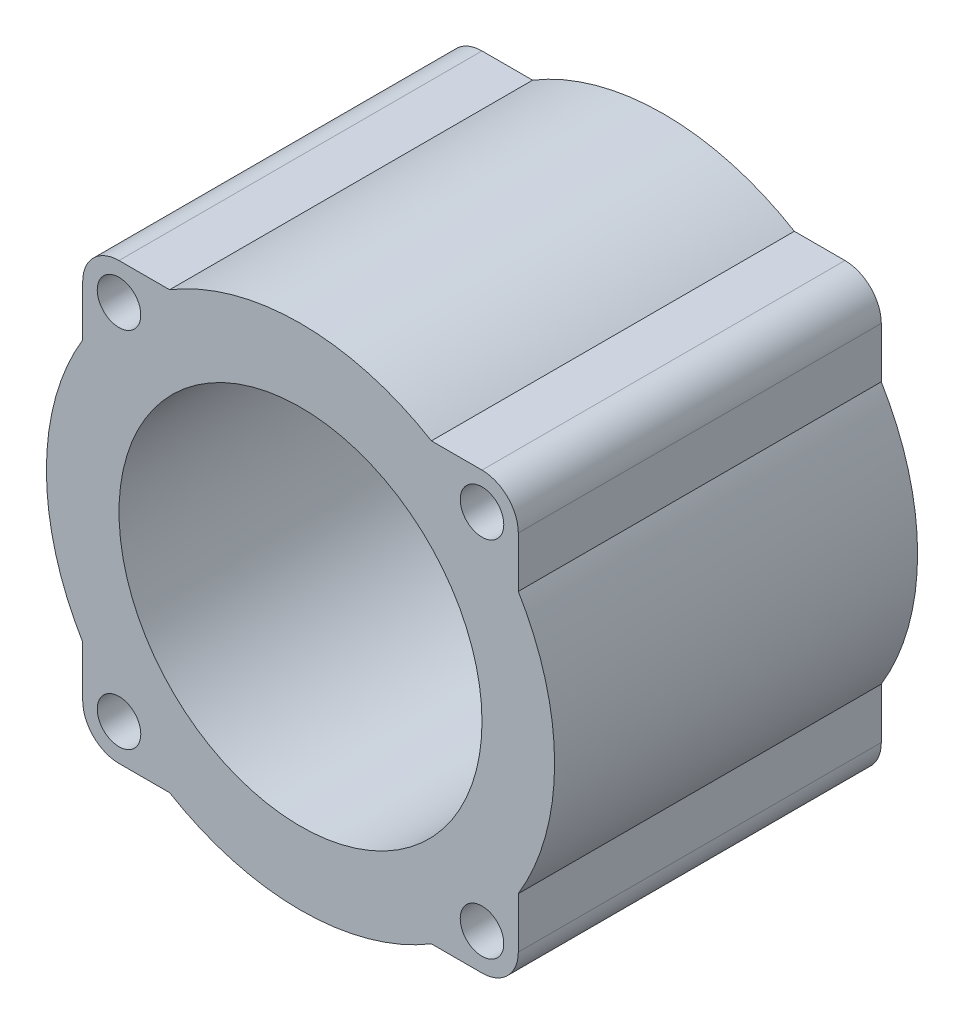
ISO-10303-21;
HEADER;
FILE_DESCRIPTION(('STEP AP214'),'2;1');
FILE_NAME('part.step','',(''),(''),'','','');
FILE_SCHEMA(('AUTOMOTIVE_DESIGN { 1 0 10303 214 1 1 1 1 }'));
ENDSEC;
DATA;
#1=APPLICATION_CONTEXT('core data for automotive mechanical design processes');
#2=APPLICATION_PROTOCOL_DEFINITION('international standard','automotive_design',2000,#1);
#3=PRODUCT_CONTEXT('',#1,'mechanical');
#4=PRODUCT('Part','Part','',(#3));
#5=PRODUCT_RELATED_PRODUCT_CATEGORY('part','',(#4));
#6=PRODUCT_DEFINITION_FORMATION('','',#4);
#7=PRODUCT_DEFINITION_CONTEXT('part definition',#1,'design');
#8=PRODUCT_DEFINITION('design','',#6,#7);
#9=PRODUCT_DEFINITION_SHAPE('','',#8);
#10=(LENGTH_UNIT() NAMED_UNIT(*) SI_UNIT(.MILLI.,.METRE.));
#11=(NAMED_UNIT(*) PLANE_ANGLE_UNIT() SI_UNIT($,.RADIAN.));
#12=(NAMED_UNIT(*) SI_UNIT($,.STERADIAN.) SOLID_ANGLE_UNIT());
#13=UNCERTAINTY_MEASURE_WITH_UNIT(LENGTH_MEASURE(1.E-05),#10,'distance_accuracy_value','');
#14=(GEOMETRIC_REPRESENTATION_CONTEXT(3) GLOBAL_UNCERTAINTY_ASSIGNED_CONTEXT((#13)) GLOBAL_UNIT_ASSIGNED_CONTEXT((#10,
#11,#12)) REPRESENTATION_CONTEXT('',''));
#15=CARTESIAN_POINT('',(0.,0.,0.));
#16=DIRECTION('',(0.,0.,1.));
#17=DIRECTION('',(1.,0.,0.));
#18=AXIS2_PLACEMENT_3D('',#15,#16,#17);
#19=CARTESIAN_POINT('',(5.,5.,10.));
#20=DIRECTION('',(0.,0.,1.));
#21=DIRECTION('',(1.,0.,0.));
#22=AXIS2_PLACEMENT_3D('',#19,#20,#21);
#23=PLANE('',#22);
#24=CARTESIAN_POINT('',(5.,-5.,10.));
#25=DIRECTION('',(0.,0.,1.));
#26=DIRECTION('',(-1.,0.,0.));
#27=AXIS2_PLACEMENT_3D('',#24,#25,#26);
#28=CIRCLE('',#27,0.6);
#29=CARTESIAN_POINT('',(4.4,-5.,10.));
#30=VERTEX_POINT('',#29);
#31=EDGE_CURVE('E353',#30,#30,#28,.T.);
#32=ORIENTED_EDGE('',*,*,#31,.F.);
#33=EDGE_LOOP('',(#32));
#34=FACE_BOUND('',#33,.T.);
#35=CARTESIAN_POINT('',(-5.,5.,10.));
#36=DIRECTION('',(0.,0.,1.));
#37=DIRECTION('',(-1.,0.,0.));
#38=AXIS2_PLACEMENT_3D('',#35,#36,#37);
#39=CIRCLE('',#38,0.6);
#40=CARTESIAN_POINT('',(-5.6,5.,10.));
#41=VERTEX_POINT('',#40);
#42=EDGE_CURVE('E365',#41,#41,#39,.T.);
#43=ORIENTED_EDGE('',*,*,#42,.F.);
#44=EDGE_LOOP('',(#43));
#45=FACE_BOUND('',#44,.T.);
#46=CARTESIAN_POINT('',(5.,5.,10.));
#47=DIRECTION('',(0.,0.,1.));
#48=DIRECTION('',(1.,0.,0.));
#49=AXIS2_PLACEMENT_3D('',#46,#47,#48);
#50=CIRCLE('',#49,1.);
#51=CARTESIAN_POINT('',(6.,4.99999999999999,10.));
#52=VERTEX_POINT('',#51);
#53=CARTESIAN_POINT('',(4.99999999999999,6.,10.));
#54=VERTEX_POINT('',#53);
#55=EDGE_CURVE('E215',#52,#54,#50,.T.);
#56=ORIENTED_EDGE('',*,*,#55,.T.);
#57=DIRECTION('',(-1.,0.,0.));
#58=VECTOR('',#57,1.);
#59=CARTESIAN_POINT('',(3.60555127546399,6.,10.));
#60=LINE('',#59,#58);
#61=CARTESIAN_POINT('',(3.60555127546399,6.,10.));
#62=VERTEX_POINT('',#61);
#63=EDGE_CURVE('E123',#54,#62,#60,.T.);
#64=ORIENTED_EDGE('',*,*,#63,.T.);
#65=CARTESIAN_POINT('',(0.,0.,10.));
#66=DIRECTION('',(0.,0.,1.));
#67=DIRECTION('',(1.,0.,0.));
#68=AXIS2_PLACEMENT_3D('',#65,#66,#67);
#69=CIRCLE('',#68,7.);
#70=CARTESIAN_POINT('',(-3.60555127546399,6.,10.));
#71=VERTEX_POINT('',#70);
#72=EDGE_CURVE('E254',#62,#71,#69,.T.);
#73=ORIENTED_EDGE('',*,*,#72,.T.);
#74=DIRECTION('',(-1.,0.,0.));
#75=VECTOR('',#74,1.);
#76=CARTESIAN_POINT('',(-3.60555127546399,6.,10.));
#77=LINE('',#76,#75);
#78=CARTESIAN_POINT('',(-4.99999999999999,6.,10.));
#79=VERTEX_POINT('',#78);
#80=EDGE_CURVE('E273',#71,#79,#77,.T.);
#81=ORIENTED_EDGE('',*,*,#80,.T.);
#82=CARTESIAN_POINT('',(-5.,5.,10.));
#83=DIRECTION('',(0.,0.,1.));
#84=DIRECTION('',(-1.,0.,0.));
#85=AXIS2_PLACEMENT_3D('',#82,#83,#84);
#86=CIRCLE('',#85,1.);
#87=CARTESIAN_POINT('',(-6.,4.99999999999999,10.));
#88=VERTEX_POINT('',#87);
#89=EDGE_CURVE('E270',#79,#88,#86,.T.);
#90=ORIENTED_EDGE('',*,*,#89,.T.);
#91=DIRECTION('',(0.,-1.,0.));
#92=VECTOR('',#91,1.);
#93=CARTESIAN_POINT('',(-6.,4.99999999999999,10.));
#94=LINE('',#93,#92);
#95=CARTESIAN_POINT('',(-6.,3.60555127546399,10.));
#96=VERTEX_POINT('',#95);
#97=EDGE_CURVE('E272',#88,#96,#94,.T.);
#98=ORIENTED_EDGE('',*,*,#97,.T.);
#99=CARTESIAN_POINT('',(0.,0.,10.));
#100=DIRECTION('',(0.,0.,1.));
#101=DIRECTION('',(1.,0.,0.));
#102=AXIS2_PLACEMENT_3D('',#99,#100,#101);
#103=CIRCLE('',#102,7.);
#104=CARTESIAN_POINT('',(-6.,-3.60555127546399,10.));
#105=VERTEX_POINT('',#104);
#106=EDGE_CURVE('E275',#96,#105,#103,.T.);
#107=ORIENTED_EDGE('',*,*,#106,.T.);
#108=DIRECTION('',(0.,-1.,0.));
#109=VECTOR('',#108,1.);
#110=CARTESIAN_POINT('',(-6.,-4.99999999999999,10.));
#111=LINE('',#110,#109);
#112=CARTESIAN_POINT('',(-6.,-4.99999999999999,10.));
#113=VERTEX_POINT('',#112);
#114=EDGE_CURVE('E281',#105,#113,#111,.T.);
#115=ORIENTED_EDGE('',*,*,#114,.T.);
#116=CARTESIAN_POINT('',(-5.,-5.,10.));
#117=DIRECTION('',(0.,0.,1.));
#118=DIRECTION('',(1.,0.,0.));
#119=AXIS2_PLACEMENT_3D('',#116,#117,#118);
#120=CIRCLE('',#119,1.);
#121=CARTESIAN_POINT('',(-4.99999999999999,-6.,10.));
#122=VERTEX_POINT('',#121);
#123=EDGE_CURVE('E283',#113,#122,#120,.T.);
#124=ORIENTED_EDGE('',*,*,#123,.T.);
#125=DIRECTION('',(1.,0.,0.));
#126=VECTOR('',#125,1.);
#127=CARTESIAN_POINT('',(-3.60555127546399,-6.,10.));
#128=LINE('',#127,#126);
#129=CARTESIAN_POINT('',(-3.60555127546399,-6.,10.));
#130=VERTEX_POINT('',#129);
#131=EDGE_CURVE('E285',#122,#130,#128,.T.);
#132=ORIENTED_EDGE('',*,*,#131,.T.);
#133=CARTESIAN_POINT('',(0.,0.,10.));
#134=DIRECTION('',(0.,0.,1.));
#135=DIRECTION('',(1.,0.,0.));
#136=AXIS2_PLACEMENT_3D('',#133,#134,#135);
#137=CIRCLE('',#136,7.);
#138=CARTESIAN_POINT('',(3.60555127546399,-6.,10.));
#139=VERTEX_POINT('',#138);
#140=EDGE_CURVE('E287',#130,#139,#137,.T.);
#141=ORIENTED_EDGE('',*,*,#140,.T.);
#142=DIRECTION('',(1.,0.,0.));
#143=VECTOR('',#142,1.);
#144=CARTESIAN_POINT('',(3.60555127546399,-6.,10.));
#145=LINE('',#144,#143);
#146=CARTESIAN_POINT('',(4.99999999999999,-6.,10.));
#147=VERTEX_POINT('',#146);
#148=EDGE_CURVE('E289',#139,#147,#145,.T.);
#149=ORIENTED_EDGE('',*,*,#148,.T.);
#150=CARTESIAN_POINT('',(5.,-5.,10.));
#151=DIRECTION('',(0.,0.,1.));
#152=DIRECTION('',(-1.,0.,0.));
#153=AXIS2_PLACEMENT_3D('',#150,#151,#152);
#154=CIRCLE('',#153,1.);
#155=CARTESIAN_POINT('',(6.,-4.99999999999999,10.));
#156=VERTEX_POINT('',#155);
#157=EDGE_CURVE('E166',#147,#156,#154,.T.);
#158=ORIENTED_EDGE('',*,*,#157,.T.);
#159=DIRECTION('',(0.,1.,0.));
#160=VECTOR('',#159,1.);
#161=CARTESIAN_POINT('',(6.,-4.99999999999999,10.));
#162=LINE('',#161,#160);
#163=CARTESIAN_POINT('',(6.,-3.60555127546399,10.));
#164=VERTEX_POINT('',#163);
#165=EDGE_CURVE('E160',#156,#164,#162,.T.);
#166=ORIENTED_EDGE('',*,*,#165,.T.);
#167=CARTESIAN_POINT('',(0.,0.,10.));
#168=DIRECTION('',(0.,0.,1.));
#169=DIRECTION('',(1.,0.,0.));
#170=AXIS2_PLACEMENT_3D('',#167,#168,#169);
#171=CIRCLE('',#170,7.);
#172=CARTESIAN_POINT('',(6.,3.60555127546399,10.));
#173=VERTEX_POINT('',#172);
#174=EDGE_CURVE('E164',#164,#173,#171,.T.);
#175=ORIENTED_EDGE('',*,*,#174,.T.);
#176=DIRECTION('',(0.,1.,0.));
#177=VECTOR('',#176,1.);
#178=CARTESIAN_POINT('',(6.,4.99999999999999,10.));
#179=LINE('',#178,#177);
#180=EDGE_CURVE('E56',#173,#52,#179,.T.);
#181=ORIENTED_EDGE('',*,*,#180,.T.);
#182=EDGE_LOOP('',(#56,#64,#73,#81,#90,#98,#107,#115,#124,#132,#141,#149,#158,#166,#175,#181));
#183=FACE_BOUND('',#182,.T.);
#184=CARTESIAN_POINT('',(5.,5.,10.));
#185=DIRECTION('',(0.,0.,1.));
#186=DIRECTION('',(1.,0.,0.));
#187=AXIS2_PLACEMENT_3D('',#184,#185,#186);
#188=CIRCLE('',#187,0.6);
#189=CARTESIAN_POINT('',(5.6,5.,10.));
#190=VERTEX_POINT('',#189);
#191=EDGE_CURVE('E188',#190,#190,#188,.T.);
#192=ORIENTED_EDGE('',*,*,#191,.F.);
#193=EDGE_LOOP('',(#192));
#194=FACE_BOUND('',#193,.T.);
#195=CARTESIAN_POINT('',(0.,0.,10.));
#196=DIRECTION('',(0.,0.,1.));
#197=DIRECTION('',(1.,0.,0.));
#198=AXIS2_PLACEMENT_3D('',#195,#196,#197);
#199=CIRCLE('',#198,5.);
#200=CARTESIAN_POINT('',(5.,0.,10.));
#201=VERTEX_POINT('',#200);
#202=EDGE_CURVE('E359',#201,#201,#199,.T.);
#203=ORIENTED_EDGE('',*,*,#202,.F.);
#204=EDGE_LOOP('',(#203));
#205=FACE_BOUND('',#204,.T.);
#206=CARTESIAN_POINT('',(-5.,-5.,10.));
#207=DIRECTION('',(0.,0.,1.));
#208=DIRECTION('',(1.,0.,0.));
#209=AXIS2_PLACEMENT_3D('',#206,#207,#208);
#210=CIRCLE('',#209,0.6);
#211=CARTESIAN_POINT('',(-4.4,-5.,10.));
#212=VERTEX_POINT('',#211);
#213=EDGE_CURVE('E344',#212,#212,#210,.T.);
#214=ORIENTED_EDGE('',*,*,#213,.F.);
#215=EDGE_LOOP('',(#214));
#216=FACE_BOUND('',#215,.T.);
#217=ADVANCED_FACE('F39',(#34,#45,#183,#194,#205,#216),#23,.T.);
#218=CARTESIAN_POINT('',(5.,5.,0.));
#219=DIRECTION('',(0.,0.,1.));
#220=DIRECTION('',(1.,0.,0.));
#221=AXIS2_PLACEMENT_3D('',#218,#219,#220);
#222=PLANE('',#221);
#223=CARTESIAN_POINT('',(5.,5.,0.));
#224=DIRECTION('',(0.,0.,1.));
#225=DIRECTION('',(1.,0.,0.));
#226=AXIS2_PLACEMENT_3D('',#223,#224,#225);
#227=CIRCLE('',#226,1.);
#228=CARTESIAN_POINT('',(6.,4.99999999999999,0.));
#229=VERTEX_POINT('',#228);
#230=CARTESIAN_POINT('',(4.99999999999999,6.,0.));
#231=VERTEX_POINT('',#230);
#232=EDGE_CURVE('E184',#229,#231,#227,.T.);
#233=ORIENTED_EDGE('',*,*,#232,.F.);
#234=DIRECTION('',(0.,1.,0.));
#235=VECTOR('',#234,1.);
#236=CARTESIAN_POINT('',(6.,4.99999999999999,0.));
#237=LINE('',#236,#235);
#238=CARTESIAN_POINT('',(6.,3.60555127546399,0.));
#239=VERTEX_POINT('',#238);
#240=EDGE_CURVE('E115',#239,#229,#237,.T.);
#241=ORIENTED_EDGE('',*,*,#240,.F.);
#242=CARTESIAN_POINT('',(0.,0.,0.));
#243=DIRECTION('',(0.,0.,1.));
#244=DIRECTION('',(1.,0.,0.));
#245=AXIS2_PLACEMENT_3D('',#242,#243,#244);
#246=CIRCLE('',#245,7.);
#247=CARTESIAN_POINT('',(6.,-3.60555127546399,0.));
#248=VERTEX_POINT('',#247);
#249=EDGE_CURVE('E109',#248,#239,#246,.T.);
#250=ORIENTED_EDGE('',*,*,#249,.F.);
#251=DIRECTION('',(0.,1.,0.));
#252=VECTOR('',#251,1.);
#253=CARTESIAN_POINT('',(6.,-4.99999999999999,0.));
#254=LINE('',#253,#252);
#255=CARTESIAN_POINT('',(6.,-4.99999999999999,0.));
#256=VERTEX_POINT('',#255);
#257=EDGE_CURVE('E174',#256,#248,#254,.T.);
#258=ORIENTED_EDGE('',*,*,#257,.F.);
#259=CARTESIAN_POINT('',(5.,-5.,0.));
#260=DIRECTION('',(0.,0.,1.));
#261=DIRECTION('',(-1.,0.,0.));
#262=AXIS2_PLACEMENT_3D('',#259,#260,#261);
#263=CIRCLE('',#262,1.);
#264=CARTESIAN_POINT('',(4.99999999999999,-6.,0.));
#265=VERTEX_POINT('',#264);
#266=EDGE_CURVE('E210',#265,#256,#263,.T.);
#267=ORIENTED_EDGE('',*,*,#266,.F.);
#268=DIRECTION('',(1.,0.,0.));
#269=VECTOR('',#268,1.);
#270=CARTESIAN_POINT('',(3.60555127546399,-6.,0.));
#271=LINE('',#270,#269);
#272=CARTESIAN_POINT('',(3.60555127546399,-6.,0.));
#273=VERTEX_POINT('',#272);
#274=EDGE_CURVE('E208',#273,#265,#271,.T.);
#275=ORIENTED_EDGE('',*,*,#274,.F.);
#276=CARTESIAN_POINT('',(0.,0.,0.));
#277=DIRECTION('',(0.,0.,1.));
#278=DIRECTION('',(1.,0.,0.));
#279=AXIS2_PLACEMENT_3D('',#276,#277,#278);
#280=CIRCLE('',#279,7.);
#281=CARTESIAN_POINT('',(-3.60555127546399,-6.,0.));
#282=VERTEX_POINT('',#281);
#283=EDGE_CURVE('E206',#282,#273,#280,.T.);
#284=ORIENTED_EDGE('',*,*,#283,.F.);
#285=DIRECTION('',(1.,0.,0.));
#286=VECTOR('',#285,1.);
#287=CARTESIAN_POINT('',(-3.60555127546399,-6.,0.));
#288=LINE('',#287,#286);
#289=CARTESIAN_POINT('',(-4.99999999999999,-6.,0.));
#290=VERTEX_POINT('',#289);
#291=EDGE_CURVE('E204',#290,#282,#288,.T.);
#292=ORIENTED_EDGE('',*,*,#291,.F.);
#293=CARTESIAN_POINT('',(-5.,-5.,0.));
#294=DIRECTION('',(0.,0.,1.));
#295=DIRECTION('',(1.,0.,0.));
#296=AXIS2_PLACEMENT_3D('',#293,#294,#295);
#297=CIRCLE('',#296,1.);
#298=CARTESIAN_POINT('',(-6.,-4.99999999999999,0.));
#299=VERTEX_POINT('',#298);
#300=EDGE_CURVE('E202',#299,#290,#297,.T.);
#301=ORIENTED_EDGE('',*,*,#300,.F.);
#302=DIRECTION('',(0.,-1.,0.));
#303=VECTOR('',#302,1.);
#304=CARTESIAN_POINT('',(-6.,-4.99999999999999,0.));
#305=LINE('',#304,#303);
#306=CARTESIAN_POINT('',(-6.,-3.60555127546399,0.));
#307=VERTEX_POINT('',#306);
#308=EDGE_CURVE('E200',#307,#299,#305,.T.);
#309=ORIENTED_EDGE('',*,*,#308,.F.);
#310=CARTESIAN_POINT('',(0.,0.,0.));
#311=DIRECTION('',(0.,0.,1.));
#312=DIRECTION('',(1.,0.,0.));
#313=AXIS2_PLACEMENT_3D('',#310,#311,#312);
#314=CIRCLE('',#313,7.);
#315=CARTESIAN_POINT('',(-6.,3.60555127546399,0.));
#316=VERTEX_POINT('',#315);
#317=EDGE_CURVE('E198',#316,#307,#314,.T.);
#318=ORIENTED_EDGE('',*,*,#317,.F.);
#319=DIRECTION('',(0.,-1.,0.));
#320=VECTOR('',#319,1.);
#321=CARTESIAN_POINT('',(-6.,4.99999999999999,0.));
#322=LINE('',#321,#320);
#323=CARTESIAN_POINT('',(-6.,4.99999999999999,0.));
#324=VERTEX_POINT('',#323);
#325=EDGE_CURVE('E196',#324,#316,#322,.T.);
#326=ORIENTED_EDGE('',*,*,#325,.F.);
#327=CARTESIAN_POINT('',(-5.,5.,0.));
#328=DIRECTION('',(0.,0.,1.));
#329=DIRECTION('',(-1.,0.,0.));
#330=AXIS2_PLACEMENT_3D('',#327,#328,#329);
#331=CIRCLE('',#330,1.);
#332=CARTESIAN_POINT('',(-4.99999999999999,6.,0.));
#333=VERTEX_POINT('',#332);
#334=EDGE_CURVE('E194',#333,#324,#331,.T.);
#335=ORIENTED_EDGE('',*,*,#334,.F.);
#336=DIRECTION('',(-1.,0.,0.));
#337=VECTOR('',#336,1.);
#338=CARTESIAN_POINT('',(-3.60555127546399,6.,0.));
#339=LINE('',#338,#337);
#340=CARTESIAN_POINT('',(-3.60555127546399,6.,0.));
#341=VERTEX_POINT('',#340);
#342=EDGE_CURVE('E192',#341,#333,#339,.T.);
#343=ORIENTED_EDGE('',*,*,#342,.F.);
#344=CARTESIAN_POINT('',(0.,0.,0.));
#345=DIRECTION('',(0.,0.,1.));
#346=DIRECTION('',(1.,0.,0.));
#347=AXIS2_PLACEMENT_3D('',#344,#345,#346);
#348=CIRCLE('',#347,7.);
#349=CARTESIAN_POINT('',(3.60555127546399,6.,0.));
#350=VERTEX_POINT('',#349);
#351=EDGE_CURVE('E190',#350,#341,#348,.T.);
#352=ORIENTED_EDGE('',*,*,#351,.F.);
#353=DIRECTION('',(-1.,0.,0.));
#354=VECTOR('',#353,1.);
#355=CARTESIAN_POINT('',(3.60555127546399,6.,0.));
#356=LINE('',#355,#354);
#357=EDGE_CURVE('E187',#231,#350,#356,.T.);
#358=ORIENTED_EDGE('',*,*,#357,.F.);
#359=EDGE_LOOP('',(#233,#241,#250,#258,#267,#275,#284,#292,#301,#309,#318,#326,#335,#343,#352,#358));
#360=FACE_BOUND('',#359,.T.);
#361=CARTESIAN_POINT('',(5.,5.,0.));
#362=DIRECTION('',(0.,0.,1.));
#363=DIRECTION('',(1.,0.,0.));
#364=AXIS2_PLACEMENT_3D('',#361,#362,#363);
#365=CIRCLE('',#364,0.6);
#366=CARTESIAN_POINT('',(5.6,5.,0.));
#367=VERTEX_POINT('',#366);
#368=EDGE_CURVE('E368',#367,#367,#365,.T.);
#369=ORIENTED_EDGE('',*,*,#368,.T.);
#370=EDGE_LOOP('',(#369));
#371=FACE_BOUND('',#370,.T.);
#372=CARTESIAN_POINT('',(-5.,5.,0.));
#373=DIRECTION('',(0.,0.,1.));
#374=DIRECTION('',(-1.,0.,0.));
#375=AXIS2_PLACEMENT_3D('',#372,#373,#374);
#376=CIRCLE('',#375,0.6);
#377=CARTESIAN_POINT('',(-5.6,5.,0.));
#378=VERTEX_POINT('',#377);
#379=EDGE_CURVE('E362',#378,#378,#376,.T.);
#380=ORIENTED_EDGE('',*,*,#379,.T.);
#381=EDGE_LOOP('',(#380));
#382=FACE_BOUND('',#381,.T.);
#383=CARTESIAN_POINT('',(0.,0.,0.));
#384=DIRECTION('',(0.,0.,1.));
#385=DIRECTION('',(1.,0.,0.));
#386=AXIS2_PLACEMENT_3D('',#383,#384,#385);
#387=CIRCLE('',#386,5.);
#388=CARTESIAN_POINT('',(5.,0.,0.));
#389=VERTEX_POINT('',#388);
#390=EDGE_CURVE('E356',#389,#389,#387,.T.);
#391=ORIENTED_EDGE('',*,*,#390,.T.);
#392=EDGE_LOOP('',(#391));
#393=FACE_BOUND('',#392,.T.);
#394=CARTESIAN_POINT('',(5.,-5.,0.));
#395=DIRECTION('',(0.,0.,1.));
#396=DIRECTION('',(-1.,0.,0.));
#397=AXIS2_PLACEMENT_3D('',#394,#395,#396);
#398=CIRCLE('',#397,0.6);
#399=CARTESIAN_POINT('',(4.4,-5.,0.));
#400=VERTEX_POINT('',#399);
#401=EDGE_CURVE('E350',#400,#400,#398,.T.);
#402=ORIENTED_EDGE('',*,*,#401,.T.);
#403=EDGE_LOOP('',(#402));
#404=FACE_BOUND('',#403,.T.);
#405=CARTESIAN_POINT('',(-5.,-5.,0.));
#406=DIRECTION('',(0.,0.,1.));
#407=DIRECTION('',(1.,0.,0.));
#408=AXIS2_PLACEMENT_3D('',#405,#406,#407);
#409=CIRCLE('',#408,0.6);
#410=CARTESIAN_POINT('',(-4.4,-5.,0.));
#411=VERTEX_POINT('',#410);
#412=EDGE_CURVE('E347',#411,#411,#409,.T.);
#413=ORIENTED_EDGE('',*,*,#412,.T.);
#414=EDGE_LOOP('',(#413));
#415=FACE_BOUND('',#414,.T.);
#416=ADVANCED_FACE('F258',(#360,#371,#382,#393,#404,#415),#222,.F.);
#417=CARTESIAN_POINT('',(5.,5.,10.));
#418=DIRECTION('',(0.,0.,-1.));
#419=DIRECTION('',(-1.,0.,0.));
#420=AXIS2_PLACEMENT_3D('',#417,#418,#419);
#421=CYLINDRICAL_SURFACE('',#420,1.);
#422=ORIENTED_EDGE('',*,*,#232,.T.);
#423=DIRECTION('',(0.,0.,-1.));
#424=VECTOR('',#423,1.);
#425=CARTESIAN_POINT('',(4.99999999999999,6.,10.));
#426=LINE('',#425,#424);
#427=EDGE_CURVE('E11',#54,#231,#426,.T.);
#428=ORIENTED_EDGE('',*,*,#427,.F.);
#429=ORIENTED_EDGE('',*,*,#55,.F.);
#430=DIRECTION('',(0.,0.,-1.));
#431=VECTOR('',#430,1.);
#432=CARTESIAN_POINT('',(6.,4.99999999999999,10.));
#433=LINE('',#432,#431);
#434=EDGE_CURVE('E180',#52,#229,#433,.T.);
#435=ORIENTED_EDGE('',*,*,#434,.T.);
#436=EDGE_LOOP('',(#422,#428,#429,#435));
#437=FACE_BOUND('',#436,.T.);
#438=ADVANCED_FACE('F41',(#437),#421,.T.);
#439=CARTESIAN_POINT('',(3.60555127546399,6.,10.));
#440=DIRECTION('',(0.,-1.,0.));
#441=DIRECTION('',(0.,0.,-1.));
#442=AXIS2_PLACEMENT_3D('',#439,#440,#441);
#443=PLANE('',#442);
#444=ORIENTED_EDGE('',*,*,#357,.T.);
#445=DIRECTION('',(0.,0.,-1.));
#446=VECTOR('',#445,1.);
#447=CARTESIAN_POINT('',(3.60555127546399,6.,10.));
#448=LINE('',#447,#446);
#449=EDGE_CURVE('E48',#62,#350,#448,.T.);
#450=ORIENTED_EDGE('',*,*,#449,.F.);
#451=ORIENTED_EDGE('',*,*,#63,.F.);
#452=ORIENTED_EDGE('',*,*,#427,.T.);
#453=EDGE_LOOP('',(#444,#450,#451,#452));
#454=FACE_BOUND('',#453,.T.);
#455=ADVANCED_FACE('F508',(#454),#443,.F.);
#456=CARTESIAN_POINT('',(0.,0.,10.));
#457=DIRECTION('',(0.,0.,-1.));
#458=DIRECTION('',(-1.,0.,0.));
#459=AXIS2_PLACEMENT_3D('',#456,#457,#458);
#460=CYLINDRICAL_SURFACE('',#459,7.);
#461=ORIENTED_EDGE('',*,*,#351,.T.);
#462=DIRECTION('',(0.,0.,-1.));
#463=VECTOR('',#462,1.);
#464=CARTESIAN_POINT('',(-3.60555127546399,6.,10.));
#465=LINE('',#464,#463);
#466=EDGE_CURVE('E246',#71,#341,#465,.T.);
#467=ORIENTED_EDGE('',*,*,#466,.F.);
#468=ORIENTED_EDGE('',*,*,#72,.F.);
#469=ORIENTED_EDGE('',*,*,#449,.T.);
#470=EDGE_LOOP('',(#461,#467,#468,#469));
#471=FACE_BOUND('',#470,.T.);
#472=ADVANCED_FACE('F252',(#471),#460,.T.);
#473=CARTESIAN_POINT('',(-3.60555127546399,6.,10.));
#474=DIRECTION('',(0.,-1.,0.));
#475=DIRECTION('',(0.,0.,-1.));
#476=AXIS2_PLACEMENT_3D('',#473,#474,#475);
#477=PLANE('',#476);
#478=ORIENTED_EDGE('',*,*,#342,.T.);
#479=DIRECTION('',(0.,0.,-1.));
#480=VECTOR('',#479,1.);
#481=CARTESIAN_POINT('',(-4.99999999999999,6.,10.));
#482=LINE('',#481,#480);
#483=EDGE_CURVE('E243',#79,#333,#482,.T.);
#484=ORIENTED_EDGE('',*,*,#483,.F.);
#485=ORIENTED_EDGE('',*,*,#80,.F.);
#486=ORIENTED_EDGE('',*,*,#466,.T.);
#487=EDGE_LOOP('',(#478,#484,#485,#486));
#488=FACE_BOUND('',#487,.T.);
#489=ADVANCED_FACE('F264',(#488),#477,.F.);
#490=CARTESIAN_POINT('',(-5.,5.,10.));
#491=DIRECTION('',(0.,0.,-1.));
#492=DIRECTION('',(-1.,0.,0.));
#493=AXIS2_PLACEMENT_3D('',#490,#491,#492);
#494=CYLINDRICAL_SURFACE('',#493,1.);
#495=ORIENTED_EDGE('',*,*,#334,.T.);
#496=DIRECTION('',(0.,0.,-1.));
#497=VECTOR('',#496,1.);
#498=CARTESIAN_POINT('',(-6.,4.99999999999999,10.));
#499=LINE('',#498,#497);
#500=EDGE_CURVE('E240',#88,#324,#499,.T.);
#501=ORIENTED_EDGE('',*,*,#500,.F.);
#502=ORIENTED_EDGE('',*,*,#89,.F.);
#503=ORIENTED_EDGE('',*,*,#483,.T.);
#504=EDGE_LOOP('',(#495,#501,#502,#503));
#505=FACE_BOUND('',#504,.T.);
#506=ADVANCED_FACE('F268',(#505),#494,.T.);
#507=CARTESIAN_POINT('',(-6.,4.99999999999999,10.));
#508=DIRECTION('',(1.,0.,0.));
#509=DIRECTION('',(0.,1.,0.));
#510=AXIS2_PLACEMENT_3D('',#507,#508,#509);
#511=PLANE('',#510);
#512=ORIENTED_EDGE('',*,*,#325,.T.);
#513=DIRECTION('',(0.,0.,-1.));
#514=VECTOR('',#513,1.);
#515=CARTESIAN_POINT('',(-6.,3.60555127546399,10.));
#516=LINE('',#515,#514);
#517=EDGE_CURVE('E237',#96,#316,#516,.T.);
#518=ORIENTED_EDGE('',*,*,#517,.F.);
#519=ORIENTED_EDGE('',*,*,#97,.F.);
#520=ORIENTED_EDGE('',*,*,#500,.T.);
#521=EDGE_LOOP('',(#512,#518,#519,#520));
#522=FACE_BOUND('',#521,.T.);
#523=ADVANCED_FACE('F477',(#522),#511,.F.);
#524=CARTESIAN_POINT('',(0.,0.,10.));
#525=DIRECTION('',(0.,0.,-1.));
#526=DIRECTION('',(-1.,0.,0.));
#527=AXIS2_PLACEMENT_3D('',#524,#525,#526);
#528=CYLINDRICAL_SURFACE('',#527,7.);
#529=ORIENTED_EDGE('',*,*,#317,.T.);
#530=DIRECTION('',(0.,0.,-1.));
#531=VECTOR('',#530,1.);
#532=CARTESIAN_POINT('',(-6.,-3.60555127546399,10.));
#533=LINE('',#532,#531);
#534=EDGE_CURVE('E234',#105,#307,#533,.T.);
#535=ORIENTED_EDGE('',*,*,#534,.F.);
#536=ORIENTED_EDGE('',*,*,#106,.F.);
#537=ORIENTED_EDGE('',*,*,#517,.T.);
#538=EDGE_LOOP('',(#529,#535,#536,#537));
#539=FACE_BOUND('',#538,.T.);
#540=ADVANCED_FACE('F468',(#539),#528,.T.);
#541=CARTESIAN_POINT('',(-6.,-4.99999999999999,10.));
#542=DIRECTION('',(1.,0.,0.));
#543=DIRECTION('',(0.,1.,0.));
#544=AXIS2_PLACEMENT_3D('',#541,#542,#543);
#545=PLANE('',#544);
#546=ORIENTED_EDGE('',*,*,#308,.T.);
#547=DIRECTION('',(0.,0.,-1.));
#548=VECTOR('',#547,1.);
#549=CARTESIAN_POINT('',(-6.,-4.99999999999999,10.));
#550=LINE('',#549,#548);
#551=EDGE_CURVE('E231',#113,#299,#550,.T.);
#552=ORIENTED_EDGE('',*,*,#551,.F.);
#553=ORIENTED_EDGE('',*,*,#114,.F.);
#554=ORIENTED_EDGE('',*,*,#534,.T.);
#555=EDGE_LOOP('',(#546,#552,#553,#554));
#556=FACE_BOUND('',#555,.T.);
#557=ADVANCED_FACE('F459',(#556),#545,.F.);
#558=CARTESIAN_POINT('',(-5.,-5.,10.));
#559=DIRECTION('',(0.,0.,-1.));
#560=DIRECTION('',(-1.,0.,0.));
#561=AXIS2_PLACEMENT_3D('',#558,#559,#560);
#562=CYLINDRICAL_SURFACE('',#561,1.);
#563=ORIENTED_EDGE('',*,*,#300,.T.);
#564=DIRECTION('',(0.,0.,-1.));
#565=VECTOR('',#564,1.);
#566=CARTESIAN_POINT('',(-4.99999999999999,-6.,10.));
#567=LINE('',#566,#565);
#568=EDGE_CURVE('E228',#122,#290,#567,.T.);
#569=ORIENTED_EDGE('',*,*,#568,.F.);
#570=ORIENTED_EDGE('',*,*,#123,.F.);
#571=ORIENTED_EDGE('',*,*,#551,.T.);
#572=EDGE_LOOP('',(#563,#569,#570,#571));
#573=FACE_BOUND('',#572,.T.);
#574=ADVANCED_FACE('F450',(#573),#562,.T.);
#575=CARTESIAN_POINT('',(-3.60555127546399,-6.,10.));
#576=DIRECTION('',(0.,1.,0.));
#577=DIRECTION('',(0.,0.,1.));
#578=AXIS2_PLACEMENT_3D('',#575,#576,#577);
#579=PLANE('',#578);
#580=ORIENTED_EDGE('',*,*,#291,.T.);
#581=DIRECTION('',(0.,0.,-1.));
#582=VECTOR('',#581,1.);
#583=CARTESIAN_POINT('',(-3.60555127546399,-6.,10.));
#584=LINE('',#583,#582);
#585=EDGE_CURVE('E225',#130,#282,#584,.T.);
#586=ORIENTED_EDGE('',*,*,#585,.F.);
#587=ORIENTED_EDGE('',*,*,#131,.F.);
#588=ORIENTED_EDGE('',*,*,#568,.T.);
#589=EDGE_LOOP('',(#580,#586,#587,#588));
#590=FACE_BOUND('',#589,.T.);
#591=ADVANCED_FACE('F441',(#590),#579,.F.);
#592=CARTESIAN_POINT('',(0.,0.,10.));
#593=DIRECTION('',(0.,0.,-1.));
#594=DIRECTION('',(-1.,0.,0.));
#595=AXIS2_PLACEMENT_3D('',#592,#593,#594);
#596=CYLINDRICAL_SURFACE('',#595,7.);
#597=ORIENTED_EDGE('',*,*,#283,.T.);
#598=DIRECTION('',(0.,0.,-1.));
#599=VECTOR('',#598,1.);
#600=CARTESIAN_POINT('',(3.60555127546399,-6.,10.));
#601=LINE('',#600,#599);
#602=EDGE_CURVE('E222',#139,#273,#601,.T.);
#603=ORIENTED_EDGE('',*,*,#602,.F.);
#604=ORIENTED_EDGE('',*,*,#140,.F.);
#605=ORIENTED_EDGE('',*,*,#585,.T.);
#606=EDGE_LOOP('',(#597,#603,#604,#605));
#607=FACE_BOUND('',#606,.T.);
#608=ADVANCED_FACE('F433',(#607),#596,.T.);
#609=CARTESIAN_POINT('',(3.60555127546399,-6.,10.));
#610=DIRECTION('',(0.,1.,0.));
#611=DIRECTION('',(0.,0.,1.));
#612=AXIS2_PLACEMENT_3D('',#609,#610,#611);
#613=PLANE('',#612);
#614=ORIENTED_EDGE('',*,*,#274,.T.);
#615=DIRECTION('',(0.,0.,-1.));
#616=VECTOR('',#615,1.);
#617=CARTESIAN_POINT('',(4.99999999999999,-6.,10.));
#618=LINE('',#617,#616);
#619=EDGE_CURVE('E219',#147,#265,#618,.T.);
#620=ORIENTED_EDGE('',*,*,#619,.F.);
#621=ORIENTED_EDGE('',*,*,#148,.F.);
#622=ORIENTED_EDGE('',*,*,#602,.T.);
#623=EDGE_LOOP('',(#614,#620,#621,#622));
#624=FACE_BOUND('',#623,.T.);
#625=ADVANCED_FACE('F295',(#624),#613,.F.);
#626=CARTESIAN_POINT('',(5.,-5.,10.));
#627=DIRECTION('',(0.,0.,-1.));
#628=DIRECTION('',(-1.,0.,0.));
#629=AXIS2_PLACEMENT_3D('',#626,#627,#628);
#630=CYLINDRICAL_SURFACE('',#629,1.);
#631=ORIENTED_EDGE('',*,*,#266,.T.);
#632=DIRECTION('',(0.,0.,-1.));
#633=VECTOR('',#632,1.);
#634=CARTESIAN_POINT('',(6.,-4.99999999999999,10.));
#635=LINE('',#634,#633);
#636=EDGE_CURVE('E175',#156,#256,#635,.T.);
#637=ORIENTED_EDGE('',*,*,#636,.F.);
#638=ORIENTED_EDGE('',*,*,#157,.F.);
#639=ORIENTED_EDGE('',*,*,#619,.T.);
#640=EDGE_LOOP('',(#631,#637,#638,#639));
#641=FACE_BOUND('',#640,.T.);
#642=ADVANCED_FACE('F299',(#641),#630,.T.);
#643=CARTESIAN_POINT('',(6.,-4.99999999999999,10.));
#644=DIRECTION('',(-1.,0.,0.));
#645=DIRECTION('',(0.,-1.,0.));
#646=AXIS2_PLACEMENT_3D('',#643,#644,#645);
#647=PLANE('',#646);
#648=ORIENTED_EDGE('',*,*,#257,.T.);
#649=DIRECTION('',(0.,0.,-1.));
#650=VECTOR('',#649,1.);
#651=CARTESIAN_POINT('',(6.,-3.60555127546399,10.));
#652=LINE('',#651,#650);
#653=EDGE_CURVE('E171',#164,#248,#652,.T.);
#654=ORIENTED_EDGE('',*,*,#653,.F.);
#655=ORIENTED_EDGE('',*,*,#165,.F.);
#656=ORIENTED_EDGE('',*,*,#636,.T.);
#657=EDGE_LOOP('',(#648,#654,#655,#656));
#658=FACE_BOUND('',#657,.T.);
#659=ADVANCED_FACE('F172',(#658),#647,.F.);
#660=CARTESIAN_POINT('',(0.,0.,10.));
#661=DIRECTION('',(0.,0.,-1.));
#662=DIRECTION('',(-1.,0.,0.));
#663=AXIS2_PLACEMENT_3D('',#660,#661,#662);
#664=CYLINDRICAL_SURFACE('',#663,7.);
#665=ORIENTED_EDGE('',*,*,#249,.T.);
#666=DIRECTION('',(0.,0.,-1.));
#667=VECTOR('',#666,1.);
#668=CARTESIAN_POINT('',(6.,3.60555127546399,10.));
#669=LINE('',#668,#667);
#670=EDGE_CURVE('E176',#173,#239,#669,.T.);
#671=ORIENTED_EDGE('',*,*,#670,.F.);
#672=ORIENTED_EDGE('',*,*,#174,.F.);
#673=ORIENTED_EDGE('',*,*,#653,.T.);
#674=EDGE_LOOP('',(#665,#671,#672,#673));
#675=FACE_BOUND('',#674,.T.);
#676=ADVANCED_FACE('F178',(#675),#664,.T.);
#677=CARTESIAN_POINT('',(6.,4.99999999999999,10.));
#678=DIRECTION('',(-1.,0.,0.));
#679=DIRECTION('',(0.,-1.,0.));
#680=AXIS2_PLACEMENT_3D('',#677,#678,#679);
#681=PLANE('',#680);
#682=ORIENTED_EDGE('',*,*,#240,.T.);
#683=ORIENTED_EDGE('',*,*,#434,.F.);
#684=ORIENTED_EDGE('',*,*,#180,.F.);
#685=ORIENTED_EDGE('',*,*,#670,.T.);
#686=EDGE_LOOP('',(#682,#683,#684,#685));
#687=FACE_BOUND('',#686,.T.);
#688=ADVANCED_FACE('F303',(#687),#681,.F.);
#689=CARTESIAN_POINT('',(5.,5.,10.));
#690=DIRECTION('',(0.,0.,-1.));
#691=DIRECTION('',(-1.,0.,0.));
#692=AXIS2_PLACEMENT_3D('',#689,#690,#691);
#693=CYLINDRICAL_SURFACE('',#692,0.6);
#694=ORIENTED_EDGE('',*,*,#191,.T.);
#695=EDGE_LOOP('',(#694));
#696=FACE_BOUND('',#695,.T.);
#697=ORIENTED_EDGE('',*,*,#368,.F.);
#698=EDGE_LOOP('',(#697));
#699=FACE_BOUND('',#698,.T.);
#700=ADVANCED_FACE('F305',(#696,#699),#693,.F.);
#701=CARTESIAN_POINT('',(-5.,5.,10.));
#702=DIRECTION('',(0.,0.,-1.));
#703=DIRECTION('',(-1.,0.,0.));
#704=AXIS2_PLACEMENT_3D('',#701,#702,#703);
#705=CYLINDRICAL_SURFACE('',#704,0.6);
#706=ORIENTED_EDGE('',*,*,#42,.T.);
#707=EDGE_LOOP('',(#706));
#708=FACE_BOUND('',#707,.T.);
#709=ORIENTED_EDGE('',*,*,#379,.F.);
#710=EDGE_LOOP('',(#709));
#711=FACE_BOUND('',#710,.T.);
#712=ADVANCED_FACE('F311',(#708,#711),#705,.F.);
#713=CARTESIAN_POINT('',(0.,0.,10.));
#714=DIRECTION('',(0.,0.,-1.));
#715=DIRECTION('',(-1.,0.,0.));
#716=AXIS2_PLACEMENT_3D('',#713,#714,#715);
#717=CYLINDRICAL_SURFACE('',#716,5.);
#718=ORIENTED_EDGE('',*,*,#202,.T.);
#719=EDGE_LOOP('',(#718));
#720=FACE_BOUND('',#719,.T.);
#721=ORIENTED_EDGE('',*,*,#390,.F.);
#722=EDGE_LOOP('',(#721));
#723=FACE_BOUND('',#722,.T.);
#724=ADVANCED_FACE('F327',(#720,#723),#717,.F.);
#725=CARTESIAN_POINT('',(5.,-5.,10.));
#726=DIRECTION('',(0.,0.,-1.));
#727=DIRECTION('',(-1.,0.,0.));
#728=AXIS2_PLACEMENT_3D('',#725,#726,#727);
#729=CYLINDRICAL_SURFACE('',#728,0.6);
#730=ORIENTED_EDGE('',*,*,#31,.T.);
#731=EDGE_LOOP('',(#730));
#732=FACE_BOUND('',#731,.T.);
#733=ORIENTED_EDGE('',*,*,#401,.F.);
#734=EDGE_LOOP('',(#733));
#735=FACE_BOUND('',#734,.T.);
#736=ADVANCED_FACE('F331',(#732,#735),#729,.F.);
#737=CARTESIAN_POINT('',(-5.,-5.,10.));
#738=DIRECTION('',(0.,0.,-1.));
#739=DIRECTION('',(-1.,0.,0.));
#740=AXIS2_PLACEMENT_3D('',#737,#738,#739);
#741=CYLINDRICAL_SURFACE('',#740,0.6);
#742=ORIENTED_EDGE('',*,*,#213,.T.);
#743=EDGE_LOOP('',(#742));
#744=FACE_BOUND('',#743,.T.);
#745=ORIENTED_EDGE('',*,*,#412,.F.);
#746=EDGE_LOOP('',(#745));
#747=FACE_BOUND('',#746,.T.);
#748=ADVANCED_FACE('F335',(#744,#747),#741,.F.);
#749=CLOSED_SHELL('',(#217,#416,#438,#455,#472,#489,#506,#523,#540,#557,#574,#591,#608,#625,
#642,#659,#676,#688,#700,#712,#724,#736,#748));
#750=MANIFOLD_SOLID_BREP('B2',#749);
#751=ADVANCED_BREP_SHAPE_REPRESENTATION('',(#18,#750),#14);
#752=SHAPE_DEFINITION_REPRESENTATION(#9,#751);
ENDSEC;
END-ISO-10303-21;
